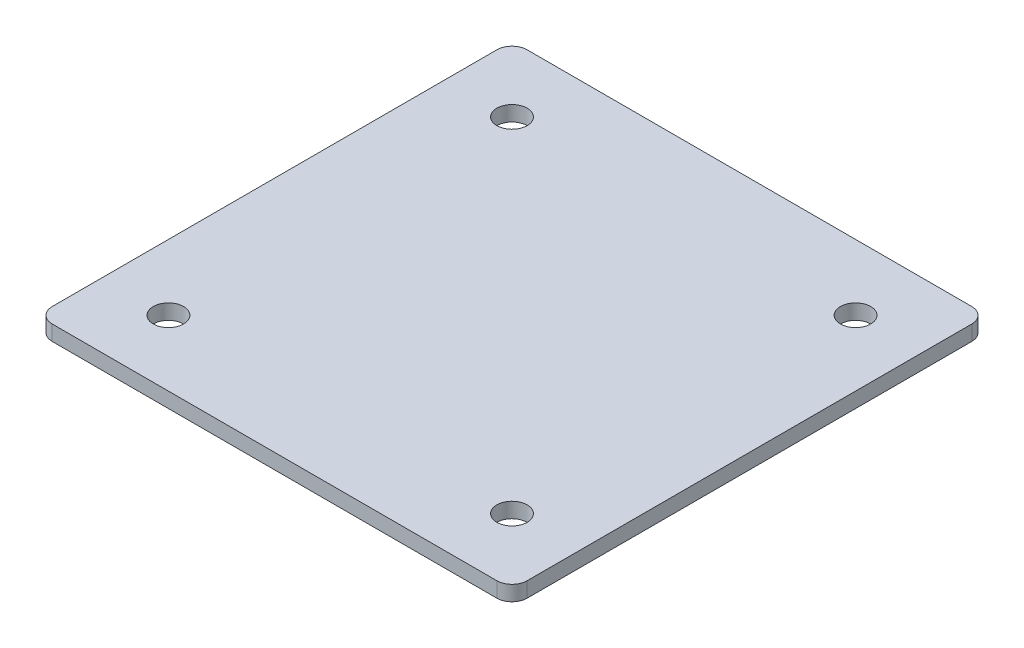
ISO-10303-21;
HEADER;
FILE_DESCRIPTION(('STEP AP214'),'2;1');
FILE_NAME('part.step','',(''),(''),'','','');
FILE_SCHEMA(('AUTOMOTIVE_DESIGN { 1 0 10303 214 1 1 1 1 }'));
ENDSEC;
DATA;
#1=APPLICATION_CONTEXT('core data for automotive mechanical design processes');
#2=APPLICATION_PROTOCOL_DEFINITION('international standard','automotive_design',2000,#1);
#3=PRODUCT_CONTEXT('',#1,'mechanical');
#4=PRODUCT('Part','Part','',(#3));
#5=PRODUCT_RELATED_PRODUCT_CATEGORY('part','',(#4));
#6=PRODUCT_DEFINITION_FORMATION('','',#4);
#7=PRODUCT_DEFINITION_CONTEXT('part definition',#1,'design');
#8=PRODUCT_DEFINITION('design','',#6,#7);
#9=PRODUCT_DEFINITION_SHAPE('','',#8);
#10=(LENGTH_UNIT() NAMED_UNIT(*) SI_UNIT(.MILLI.,.METRE.));
#11=(NAMED_UNIT(*) PLANE_ANGLE_UNIT() SI_UNIT($,.RADIAN.));
#12=(NAMED_UNIT(*) SI_UNIT($,.STERADIAN.) SOLID_ANGLE_UNIT());
#13=UNCERTAINTY_MEASURE_WITH_UNIT(LENGTH_MEASURE(1.E-05),#10,'distance_accuracy_value','');
#14=(GEOMETRIC_REPRESENTATION_CONTEXT(3) GLOBAL_UNCERTAINTY_ASSIGNED_CONTEXT((#13)) GLOBAL_UNIT_ASSIGNED_CONTEXT((#10,
#11,#12)) REPRESENTATION_CONTEXT('',''));
#15=CARTESIAN_POINT('',(0.,0.,0.));
#16=DIRECTION('',(0.,0.,1.));
#17=DIRECTION('',(1.,0.,0.));
#18=AXIS2_PLACEMENT_3D('',#15,#16,#17);
#19=CARTESIAN_POINT('',(-22.,1.5,22.));
#20=DIRECTION('',(0.,1.,0.));
#21=DIRECTION('',(0.,0.,1.));
#22=AXIS2_PLACEMENT_3D('',#19,#20,#21);
#23=PLANE('',#22);
#24=CARTESIAN_POINT('',(17.,1.5,17.));
#25=DIRECTION('',(0.,1.,0.));
#26=DIRECTION('',(0.,0.,1.));
#27=AXIS2_PLACEMENT_3D('',#24,#25,#26);
#28=CIRCLE('',#27,1.5);
#29=CARTESIAN_POINT('',(17.,1.5,18.5));
#30=VERTEX_POINT('',#29);
#31=EDGE_CURVE('E231',#30,#30,#28,.T.);
#32=ORIENTED_EDGE('',*,*,#31,.F.);
#33=EDGE_LOOP('',(#32));
#34=FACE_BOUND('',#33,.T.);
#35=CARTESIAN_POINT('',(-17.,1.5,-17.));
#36=DIRECTION('',(0.,1.,0.));
#37=DIRECTION('',(0.,0.,1.));
#38=AXIS2_PLACEMENT_3D('',#35,#36,#37);
#39=CIRCLE('',#38,1.5);
#40=CARTESIAN_POINT('',(-17.,1.5,-15.5));
#41=VERTEX_POINT('',#40);
#42=EDGE_CURVE('E156',#41,#41,#39,.T.);
#43=ORIENTED_EDGE('',*,*,#42,.F.);
#44=EDGE_LOOP('',(#43));
#45=FACE_BOUND('',#44,.T.);
#46=CARTESIAN_POINT('',(-22.,1.5,22.));
#47=DIRECTION('',(0.,1.,0.));
#48=DIRECTION('',(0.,0.,1.));
#49=AXIS2_PLACEMENT_3D('',#46,#47,#48);
#50=CIRCLE('',#49,1.5);
#51=CARTESIAN_POINT('',(-23.5,1.5,22.));
#52=VERTEX_POINT('',#51);
#53=CARTESIAN_POINT('',(-22.,1.5,23.5));
#54=VERTEX_POINT('',#53);
#55=EDGE_CURVE('E174',#52,#54,#50,.T.);
#56=ORIENTED_EDGE('',*,*,#55,.T.);
#57=DIRECTION('',(1.,0.,0.));
#58=VECTOR('',#57,1.);
#59=CARTESIAN_POINT('',(-22.,1.5,23.5));
#60=LINE('',#59,#58);
#61=CARTESIAN_POINT('',(22.,1.5,23.5));
#62=VERTEX_POINT('',#61);
#63=EDGE_CURVE('E110',#54,#62,#60,.T.);
#64=ORIENTED_EDGE('',*,*,#63,.T.);
#65=CARTESIAN_POINT('',(22.,1.5,22.));
#66=DIRECTION('',(0.,1.,0.));
#67=DIRECTION('',(0.,0.,1.));
#68=AXIS2_PLACEMENT_3D('',#65,#66,#67);
#69=CIRCLE('',#68,1.5);
#70=CARTESIAN_POINT('',(23.5,1.5,22.));
#71=VERTEX_POINT('',#70);
#72=EDGE_CURVE('E195',#62,#71,#69,.T.);
#73=ORIENTED_EDGE('',*,*,#72,.T.);
#74=DIRECTION('',(0.,0.,-1.));
#75=VECTOR('',#74,1.);
#76=CARTESIAN_POINT('',(23.5,1.5,-22.));
#77=LINE('',#76,#75);
#78=CARTESIAN_POINT('',(23.5,1.5,-22.));
#79=VERTEX_POINT('',#78);
#80=EDGE_CURVE('E209',#71,#79,#77,.T.);
#81=ORIENTED_EDGE('',*,*,#80,.T.);
#82=CARTESIAN_POINT('',(22.,1.5,-22.));
#83=DIRECTION('',(0.,1.,0.));
#84=DIRECTION('',(0.,0.,-1.));
#85=AXIS2_PLACEMENT_3D('',#82,#83,#84);
#86=CIRCLE('',#85,1.5);
#87=CARTESIAN_POINT('',(22.,1.5,-23.5));
#88=VERTEX_POINT('',#87);
#89=EDGE_CURVE('E129',#79,#88,#86,.T.);
#90=ORIENTED_EDGE('',*,*,#89,.T.);
#91=DIRECTION('',(-1.,0.,0.));
#92=VECTOR('',#91,1.);
#93=CARTESIAN_POINT('',(-22.,1.5,-23.5));
#94=LINE('',#93,#92);
#95=CARTESIAN_POINT('',(-22.,1.5,-23.5));
#96=VERTEX_POINT('',#95);
#97=EDGE_CURVE('E123',#88,#96,#94,.T.);
#98=ORIENTED_EDGE('',*,*,#97,.T.);
#99=CARTESIAN_POINT('',(-22.,1.5,-22.));
#100=DIRECTION('',(0.,1.,0.));
#101=DIRECTION('',(0.,0.,1.));
#102=AXIS2_PLACEMENT_3D('',#99,#100,#101);
#103=CIRCLE('',#102,1.5);
#104=CARTESIAN_POINT('',(-23.5,1.5,-22.));
#105=VERTEX_POINT('',#104);
#106=EDGE_CURVE('E127',#96,#105,#103,.T.);
#107=ORIENTED_EDGE('',*,*,#106,.T.);
#108=DIRECTION('',(0.,0.,1.));
#109=VECTOR('',#108,1.);
#110=CARTESIAN_POINT('',(-23.5,1.5,-22.));
#111=LINE('',#110,#109);
#112=EDGE_CURVE('E67',#105,#52,#111,.T.);
#113=ORIENTED_EDGE('',*,*,#112,.T.);
#114=EDGE_LOOP('',(#56,#64,#73,#81,#90,#98,#107,#113));
#115=FACE_BOUND('',#114,.T.);
#116=CARTESIAN_POINT('',(17.,1.5,-17.));
#117=DIRECTION('',(0.,1.,0.));
#118=DIRECTION('',(0.,0.,1.));
#119=AXIS2_PLACEMENT_3D('',#116,#117,#118);
#120=CIRCLE('',#119,1.5);
#121=CARTESIAN_POINT('',(17.,1.5,-15.5));
#122=VERTEX_POINT('',#121);
#123=EDGE_CURVE('E223',#122,#122,#120,.T.);
#124=ORIENTED_EDGE('',*,*,#123,.F.);
#125=EDGE_LOOP('',(#124));
#126=FACE_BOUND('',#125,.T.);
#127=CARTESIAN_POINT('',(-17.,1.5,17.));
#128=DIRECTION('',(0.,1.,0.));
#129=DIRECTION('',(0.,0.,1.));
#130=AXIS2_PLACEMENT_3D('',#127,#128,#129);
#131=CIRCLE('',#130,1.5);
#132=CARTESIAN_POINT('',(-17.,1.5,18.5));
#133=VERTEX_POINT('',#132);
#134=EDGE_CURVE('E239',#133,#133,#131,.T.);
#135=ORIENTED_EDGE('',*,*,#134,.F.);
#136=EDGE_LOOP('',(#135));
#137=FACE_BOUND('',#136,.T.);
#138=ADVANCED_FACE('F49',(#34,#45,#115,#126,#137),#23,.T.);
#139=CARTESIAN_POINT('',(-22.,0.,22.));
#140=DIRECTION('',(0.,1.,0.));
#141=DIRECTION('',(0.,0.,1.));
#142=AXIS2_PLACEMENT_3D('',#139,#140,#141);
#143=PLANE('',#142);
#144=CARTESIAN_POINT('',(-22.,0.,22.));
#145=DIRECTION('',(0.,1.,0.));
#146=DIRECTION('',(0.,0.,1.));
#147=AXIS2_PLACEMENT_3D('',#144,#145,#146);
#148=CIRCLE('',#147,1.5);
#149=CARTESIAN_POINT('',(-23.5,0.,22.));
#150=VERTEX_POINT('',#149);
#151=CARTESIAN_POINT('',(-22.,0.,23.5));
#152=VERTEX_POINT('',#151);
#153=EDGE_CURVE('E151',#150,#152,#148,.T.);
#154=ORIENTED_EDGE('',*,*,#153,.F.);
#155=DIRECTION('',(0.,0.,1.));
#156=VECTOR('',#155,1.);
#157=CARTESIAN_POINT('',(-23.5,0.,-22.));
#158=LINE('',#157,#156);
#159=CARTESIAN_POINT('',(-23.5,0.,-22.));
#160=VERTEX_POINT('',#159);
#161=EDGE_CURVE('E102',#160,#150,#158,.T.);
#162=ORIENTED_EDGE('',*,*,#161,.F.);
#163=CARTESIAN_POINT('',(-22.,0.,-22.));
#164=DIRECTION('',(0.,1.,0.));
#165=DIRECTION('',(0.,0.,1.));
#166=AXIS2_PLACEMENT_3D('',#163,#164,#165);
#167=CIRCLE('',#166,1.5);
#168=CARTESIAN_POINT('',(-22.,0.,-23.5));
#169=VERTEX_POINT('',#168);
#170=EDGE_CURVE('E96',#169,#160,#167,.T.);
#171=ORIENTED_EDGE('',*,*,#170,.F.);
#172=DIRECTION('',(-1.,0.,0.));
#173=VECTOR('',#172,1.);
#174=CARTESIAN_POINT('',(-22.,0.,-23.5));
#175=LINE('',#174,#173);
#176=CARTESIAN_POINT('',(22.,0.,-23.5));
#177=VERTEX_POINT('',#176);
#178=EDGE_CURVE('E138',#177,#169,#175,.T.);
#179=ORIENTED_EDGE('',*,*,#178,.F.);
#180=CARTESIAN_POINT('',(22.,0.,-22.));
#181=DIRECTION('',(0.,1.,0.));
#182=DIRECTION('',(0.,0.,-1.));
#183=AXIS2_PLACEMENT_3D('',#180,#181,#182);
#184=CIRCLE('',#183,1.5);
#185=CARTESIAN_POINT('',(23.5,0.,-22.));
#186=VERTEX_POINT('',#185);
#187=EDGE_CURVE('E165',#186,#177,#184,.T.);
#188=ORIENTED_EDGE('',*,*,#187,.F.);
#189=DIRECTION('',(0.,0.,-1.));
#190=VECTOR('',#189,1.);
#191=CARTESIAN_POINT('',(23.5,0.,-22.));
#192=LINE('',#191,#190);
#193=CARTESIAN_POINT('',(23.5,0.,22.));
#194=VERTEX_POINT('',#193);
#195=EDGE_CURVE('E162',#194,#186,#192,.T.);
#196=ORIENTED_EDGE('',*,*,#195,.F.);
#197=CARTESIAN_POINT('',(22.,0.,22.));
#198=DIRECTION('',(0.,1.,0.));
#199=DIRECTION('',(0.,0.,1.));
#200=AXIS2_PLACEMENT_3D('',#197,#198,#199);
#201=CIRCLE('',#200,1.5);
#202=CARTESIAN_POINT('',(22.,0.,23.5));
#203=VERTEX_POINT('',#202);
#204=EDGE_CURVE('E159',#203,#194,#201,.T.);
#205=ORIENTED_EDGE('',*,*,#204,.F.);
#206=DIRECTION('',(1.,0.,0.));
#207=VECTOR('',#206,1.);
#208=CARTESIAN_POINT('',(-22.,0.,23.5));
#209=LINE('',#208,#207);
#210=EDGE_CURVE('E155',#152,#203,#209,.T.);
#211=ORIENTED_EDGE('',*,*,#210,.F.);
#212=EDGE_LOOP('',(#154,#162,#171,#179,#188,#196,#205,#211));
#213=FACE_BOUND('',#212,.T.);
#214=CARTESIAN_POINT('',(-17.,0.,-17.));
#215=DIRECTION('',(0.,1.,0.));
#216=DIRECTION('',(0.,0.,1.));
#217=AXIS2_PLACEMENT_3D('',#214,#215,#216);
#218=CIRCLE('',#217,1.5);
#219=CARTESIAN_POINT('',(-17.,0.,-15.5));
#220=VERTEX_POINT('',#219);
#221=EDGE_CURVE('E219',#220,#220,#218,.T.);
#222=ORIENTED_EDGE('',*,*,#221,.T.);
#223=EDGE_LOOP('',(#222));
#224=FACE_BOUND('',#223,.T.);
#225=CARTESIAN_POINT('',(17.,0.,-17.));
#226=DIRECTION('',(0.,1.,0.));
#227=DIRECTION('',(0.,0.,1.));
#228=AXIS2_PLACEMENT_3D('',#225,#226,#227);
#229=CIRCLE('',#228,1.5);
#230=CARTESIAN_POINT('',(17.,0.,-15.5));
#231=VERTEX_POINT('',#230);
#232=EDGE_CURVE('E227',#231,#231,#229,.T.);
#233=ORIENTED_EDGE('',*,*,#232,.T.);
#234=EDGE_LOOP('',(#233));
#235=FACE_BOUND('',#234,.T.);
#236=CARTESIAN_POINT('',(17.,0.,17.));
#237=DIRECTION('',(0.,1.,0.));
#238=DIRECTION('',(0.,0.,1.));
#239=AXIS2_PLACEMENT_3D('',#236,#237,#238);
#240=CIRCLE('',#239,1.5);
#241=CARTESIAN_POINT('',(17.,0.,18.5));
#242=VERTEX_POINT('',#241);
#243=EDGE_CURVE('E235',#242,#242,#240,.T.);
#244=ORIENTED_EDGE('',*,*,#243,.T.);
#245=EDGE_LOOP('',(#244));
#246=FACE_BOUND('',#245,.T.);
#247=CARTESIAN_POINT('',(-17.,0.,17.));
#248=DIRECTION('',(0.,1.,0.));
#249=DIRECTION('',(0.,0.,1.));
#250=AXIS2_PLACEMENT_3D('',#247,#248,#249);
#251=CIRCLE('',#250,1.5);
#252=CARTESIAN_POINT('',(-17.,0.,18.5));
#253=VERTEX_POINT('',#252);
#254=EDGE_CURVE('E243',#253,#253,#251,.T.);
#255=ORIENTED_EDGE('',*,*,#254,.T.);
#256=EDGE_LOOP('',(#255));
#257=FACE_BOUND('',#256,.T.);
#258=ADVANCED_FACE('F199',(#213,#224,#235,#246,#257),#143,.F.);
#259=CARTESIAN_POINT('',(-22.,1.5,22.));
#260=DIRECTION('',(0.,-1.,0.));
#261=DIRECTION('',(0.,0.,-1.));
#262=AXIS2_PLACEMENT_3D('',#259,#260,#261);
#263=CYLINDRICAL_SURFACE('',#262,1.5);
#264=ORIENTED_EDGE('',*,*,#153,.T.);
#265=DIRECTION('',(0.,-1.,0.));
#266=VECTOR('',#265,1.);
#267=CARTESIAN_POINT('',(-22.,1.5,23.5));
#268=LINE('',#267,#266);
#269=EDGE_CURVE('E11',#54,#152,#268,.T.);
#270=ORIENTED_EDGE('',*,*,#269,.F.);
#271=ORIENTED_EDGE('',*,*,#55,.F.);
#272=DIRECTION('',(0.,-1.,0.));
#273=VECTOR('',#272,1.);
#274=CARTESIAN_POINT('',(-23.5,1.5,22.));
#275=LINE('',#274,#273);
#276=EDGE_CURVE('E147',#52,#150,#275,.T.);
#277=ORIENTED_EDGE('',*,*,#276,.T.);
#278=EDGE_LOOP('',(#264,#270,#271,#277));
#279=FACE_BOUND('',#278,.T.);
#280=ADVANCED_FACE('F51',(#279),#263,.T.);
#281=CARTESIAN_POINT('',(-22.,1.5,23.5));
#282=DIRECTION('',(0.,0.,-1.));
#283=DIRECTION('',(-1.,0.,0.));
#284=AXIS2_PLACEMENT_3D('',#281,#282,#283);
#285=PLANE('',#284);
#286=ORIENTED_EDGE('',*,*,#210,.T.);
#287=DIRECTION('',(0.,-1.,0.));
#288=VECTOR('',#287,1.);
#289=CARTESIAN_POINT('',(22.,1.5,23.5));
#290=LINE('',#289,#288);
#291=EDGE_CURVE('E59',#62,#203,#290,.T.);
#292=ORIENTED_EDGE('',*,*,#291,.F.);
#293=ORIENTED_EDGE('',*,*,#63,.F.);
#294=ORIENTED_EDGE('',*,*,#269,.T.);
#295=EDGE_LOOP('',(#286,#292,#293,#294));
#296=FACE_BOUND('',#295,.T.);
#297=ADVANCED_FACE('F279',(#296),#285,.F.);
#298=CARTESIAN_POINT('',(22.,1.5,22.));
#299=DIRECTION('',(0.,-1.,0.));
#300=DIRECTION('',(0.,0.,-1.));
#301=AXIS2_PLACEMENT_3D('',#298,#299,#300);
#302=CYLINDRICAL_SURFACE('',#301,1.5);
#303=ORIENTED_EDGE('',*,*,#204,.T.);
#304=DIRECTION('',(0.,-1.,0.));
#305=VECTOR('',#304,1.);
#306=CARTESIAN_POINT('',(23.5,1.5,22.));
#307=LINE('',#306,#305);
#308=EDGE_CURVE('E185',#71,#194,#307,.T.);
#309=ORIENTED_EDGE('',*,*,#308,.F.);
#310=ORIENTED_EDGE('',*,*,#72,.F.);
#311=ORIENTED_EDGE('',*,*,#291,.T.);
#312=EDGE_LOOP('',(#303,#309,#310,#311));
#313=FACE_BOUND('',#312,.T.);
#314=ADVANCED_FACE('F193',(#313),#302,.T.);
#315=CARTESIAN_POINT('',(23.5,1.5,-22.));
#316=DIRECTION('',(-1.,0.,0.));
#317=DIRECTION('',(0.,0.,1.));
#318=AXIS2_PLACEMENT_3D('',#315,#316,#317);
#319=PLANE('',#318);
#320=ORIENTED_EDGE('',*,*,#195,.T.);
#321=DIRECTION('',(0.,-1.,0.));
#322=VECTOR('',#321,1.);
#323=CARTESIAN_POINT('',(23.5,1.5,-22.));
#324=LINE('',#323,#322);
#325=EDGE_CURVE('E181',#79,#186,#324,.T.);
#326=ORIENTED_EDGE('',*,*,#325,.F.);
#327=ORIENTED_EDGE('',*,*,#80,.F.);
#328=ORIENTED_EDGE('',*,*,#308,.T.);
#329=EDGE_LOOP('',(#320,#326,#327,#328));
#330=FACE_BOUND('',#329,.T.);
#331=ADVANCED_FACE('F204',(#330),#319,.F.);
#332=CARTESIAN_POINT('',(22.,1.5,-22.));
#333=DIRECTION('',(0.,-1.,0.));
#334=DIRECTION('',(0.,0.,-1.));
#335=AXIS2_PLACEMENT_3D('',#332,#333,#334);
#336=CYLINDRICAL_SURFACE('',#335,1.5);
#337=ORIENTED_EDGE('',*,*,#187,.T.);
#338=DIRECTION('',(0.,-1.,0.));
#339=VECTOR('',#338,1.);
#340=CARTESIAN_POINT('',(22.,1.5,-23.5));
#341=LINE('',#340,#339);
#342=EDGE_CURVE('E140',#88,#177,#341,.T.);
#343=ORIENTED_EDGE('',*,*,#342,.F.);
#344=ORIENTED_EDGE('',*,*,#89,.F.);
#345=ORIENTED_EDGE('',*,*,#325,.T.);
#346=EDGE_LOOP('',(#337,#343,#344,#345));
#347=FACE_BOUND('',#346,.T.);
#348=ADVANCED_FACE('F207',(#347),#336,.T.);
#349=CARTESIAN_POINT('',(-22.,1.5,-23.5));
#350=DIRECTION('',(0.,0.,1.));
#351=DIRECTION('',(1.,0.,0.));
#352=AXIS2_PLACEMENT_3D('',#349,#350,#351);
#353=PLANE('',#352);
#354=ORIENTED_EDGE('',*,*,#178,.T.);
#355=DIRECTION('',(0.,-1.,0.));
#356=VECTOR('',#355,1.);
#357=CARTESIAN_POINT('',(-22.,1.5,-23.5));
#358=LINE('',#357,#356);
#359=EDGE_CURVE('E135',#96,#169,#358,.T.);
#360=ORIENTED_EDGE('',*,*,#359,.F.);
#361=ORIENTED_EDGE('',*,*,#97,.F.);
#362=ORIENTED_EDGE('',*,*,#342,.T.);
#363=EDGE_LOOP('',(#354,#360,#361,#362));
#364=FACE_BOUND('',#363,.T.);
#365=ADVANCED_FACE('F136',(#364),#353,.F.);
#366=CARTESIAN_POINT('',(-22.,1.5,-22.));
#367=DIRECTION('',(0.,-1.,0.));
#368=DIRECTION('',(0.,0.,-1.));
#369=AXIS2_PLACEMENT_3D('',#366,#367,#368);
#370=CYLINDRICAL_SURFACE('',#369,1.5);
#371=ORIENTED_EDGE('',*,*,#170,.T.);
#372=DIRECTION('',(0.,-1.,0.));
#373=VECTOR('',#372,1.);
#374=CARTESIAN_POINT('',(-23.5,1.5,-22.));
#375=LINE('',#374,#373);
#376=EDGE_CURVE('E141',#105,#160,#375,.T.);
#377=ORIENTED_EDGE('',*,*,#376,.F.);
#378=ORIENTED_EDGE('',*,*,#106,.F.);
#379=ORIENTED_EDGE('',*,*,#359,.T.);
#380=EDGE_LOOP('',(#371,#377,#378,#379));
#381=FACE_BOUND('',#380,.T.);
#382=ADVANCED_FACE('F143',(#381),#370,.T.);
#383=CARTESIAN_POINT('',(-23.5,1.5,-22.));
#384=DIRECTION('',(1.,0.,0.));
#385=DIRECTION('',(0.,0.,-1.));
#386=AXIS2_PLACEMENT_3D('',#383,#384,#385);
#387=PLANE('',#386);
#388=ORIENTED_EDGE('',*,*,#161,.T.);
#389=ORIENTED_EDGE('',*,*,#276,.F.);
#390=ORIENTED_EDGE('',*,*,#112,.F.);
#391=ORIENTED_EDGE('',*,*,#376,.T.);
#392=EDGE_LOOP('',(#388,#389,#390,#391));
#393=FACE_BOUND('',#392,.T.);
#394=ADVANCED_FACE('F267',(#393),#387,.F.);
#395=CARTESIAN_POINT('',(-17.,1.5,-17.));
#396=DIRECTION('',(0.,-1.,0.));
#397=DIRECTION('',(0.,0.,-1.));
#398=AXIS2_PLACEMENT_3D('',#395,#396,#397);
#399=CYLINDRICAL_SURFACE('',#398,1.5);
#400=ORIENTED_EDGE('',*,*,#42,.T.);
#401=EDGE_LOOP('',(#400));
#402=FACE_BOUND('',#401,.T.);
#403=ORIENTED_EDGE('',*,*,#221,.F.);
#404=EDGE_LOOP('',(#403));
#405=FACE_BOUND('',#404,.T.);
#406=ADVANCED_FACE('F264',(#402,#405),#399,.F.);
#407=CARTESIAN_POINT('',(17.,1.5,-17.));
#408=DIRECTION('',(0.,-1.,0.));
#409=DIRECTION('',(0.,0.,-1.));
#410=AXIS2_PLACEMENT_3D('',#407,#408,#409);
#411=CYLINDRICAL_SURFACE('',#410,1.5);
#412=ORIENTED_EDGE('',*,*,#123,.T.);
#413=EDGE_LOOP('',(#412));
#414=FACE_BOUND('',#413,.T.);
#415=ORIENTED_EDGE('',*,*,#232,.F.);
#416=EDGE_LOOP('',(#415));
#417=FACE_BOUND('',#416,.T.);
#418=ADVANCED_FACE('F377',(#414,#417),#411,.F.);
#419=CARTESIAN_POINT('',(17.,1.5,17.));
#420=DIRECTION('',(0.,-1.,0.));
#421=DIRECTION('',(0.,0.,-1.));
#422=AXIS2_PLACEMENT_3D('',#419,#420,#421);
#423=CYLINDRICAL_SURFACE('',#422,1.5);
#424=ORIENTED_EDGE('',*,*,#31,.T.);
#425=EDGE_LOOP('',(#424));
#426=FACE_BOUND('',#425,.T.);
#427=ORIENTED_EDGE('',*,*,#243,.F.);
#428=EDGE_LOOP('',(#427));
#429=FACE_BOUND('',#428,.T.);
#430=ADVANCED_FACE('F388',(#426,#429),#423,.F.);
#431=CARTESIAN_POINT('',(-17.,1.5,17.));
#432=DIRECTION('',(0.,-1.,0.));
#433=DIRECTION('',(0.,0.,-1.));
#434=AXIS2_PLACEMENT_3D('',#431,#432,#433);
#435=CYLINDRICAL_SURFACE('',#434,1.5);
#436=ORIENTED_EDGE('',*,*,#134,.T.);
#437=EDGE_LOOP('',(#436));
#438=FACE_BOUND('',#437,.T.);
#439=ORIENTED_EDGE('',*,*,#254,.F.);
#440=EDGE_LOOP('',(#439));
#441=FACE_BOUND('',#440,.T.);
#442=ADVANCED_FACE('F251',(#438,#441),#435,.F.);
#443=CLOSED_SHELL('',(#138,#258,#280,#297,#314,#331,#348,#365,#382,#394,#406,#418,#430,#442));
#444=MANIFOLD_SOLID_BREP('B2',#443);
#445=ADVANCED_BREP_SHAPE_REPRESENTATION('',(#18,#444),#14);
#446=SHAPE_DEFINITION_REPRESENTATION(#9,#445);
ENDSEC;
END-ISO-10303-21;
